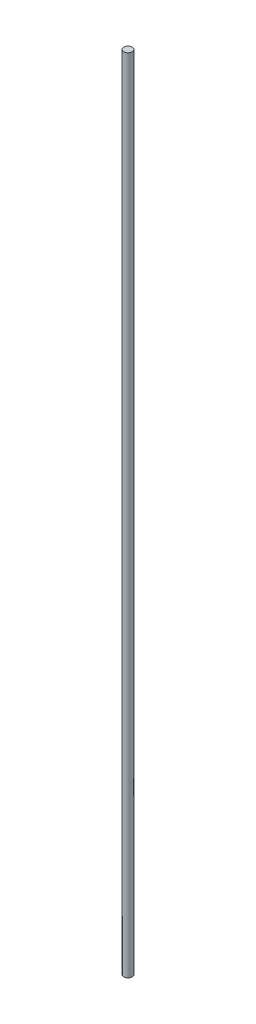
ISO-10303-21;
HEADER;
FILE_DESCRIPTION(('STEP AP214'),'2;1');
FILE_NAME('part.step','',(''),(''),'','','');
FILE_SCHEMA(('AUTOMOTIVE_DESIGN { 1 0 10303 214 1 1 1 1 }'));
ENDSEC;
DATA;
#1=APPLICATION_CONTEXT('core data for automotive mechanical design processes');
#2=APPLICATION_PROTOCOL_DEFINITION('international standard','automotive_design',2000,#1);
#3=PRODUCT_CONTEXT('',#1,'mechanical');
#4=PRODUCT('Part','Part','',(#3));
#5=PRODUCT_RELATED_PRODUCT_CATEGORY('part','',(#4));
#6=PRODUCT_DEFINITION_FORMATION('','',#4);
#7=PRODUCT_DEFINITION_CONTEXT('part definition',#1,'design');
#8=PRODUCT_DEFINITION('design','',#6,#7);
#9=PRODUCT_DEFINITION_SHAPE('','',#8);
#10=(LENGTH_UNIT() NAMED_UNIT(*) SI_UNIT(.MILLI.,.METRE.));
#11=(NAMED_UNIT(*) PLANE_ANGLE_UNIT() SI_UNIT($,.RADIAN.));
#12=(NAMED_UNIT(*) SI_UNIT($,.STERADIAN.) SOLID_ANGLE_UNIT());
#13=UNCERTAINTY_MEASURE_WITH_UNIT(LENGTH_MEASURE(1.E-05),#10,'distance_accuracy_value','');
#14=(GEOMETRIC_REPRESENTATION_CONTEXT(3) GLOBAL_UNCERTAINTY_ASSIGNED_CONTEXT((#13)) GLOBAL_UNIT_ASSIGNED_CONTEXT((#10,
#11,#12)) REPRESENTATION_CONTEXT('',''));
#15=CARTESIAN_POINT('',(0.,0.,0.));
#16=DIRECTION('',(0.,0.,1.));
#17=DIRECTION('',(1.,0.,0.));
#18=AXIS2_PLACEMENT_3D('',#15,#16,#17);
#19=CARTESIAN_POINT('',(0.,304.8,0.));
#20=DIRECTION('',(0.,-1.,0.));
#21=DIRECTION('',(0.,0.,-1.));
#22=AXIS2_PLACEMENT_3D('',#19,#20,#21);
#23=CYLINDRICAL_SURFACE('',#22,3.175);
#24=CARTESIAN_POINT('',(0.,304.8,0.));
#25=DIRECTION('',(0.,1.,0.));
#26=DIRECTION('',(0.,0.,1.));
#27=AXIS2_PLACEMENT_3D('',#24,#25,#26);
#28=CIRCLE('',#27,3.175);
#29=CARTESIAN_POINT('',(0.,304.8,-3.175));
#30=VERTEX_POINT('',#29);
#31=EDGE_CURVE('E10',#30,#30,#28,.T.);
#32=CARTESIAN_POINT('',(0.,-304.8,0.));
#33=DIRECTION('',(0.,1.,0.));
#34=DIRECTION('',(0.,0.,1.));
#35=AXIS2_PLACEMENT_3D('',#32,#33,#34);
#36=CIRCLE('',#35,3.175);
#37=CARTESIAN_POINT('',(0.,-304.8,-3.175));
#38=VERTEX_POINT('',#37);
#39=EDGE_CURVE('E36',#38,#38,#36,.T.);
#40=CARTESIAN_POINT('',(0.,304.8,-3.175));
#41=CARTESIAN_POINT('',(0.,298.45,-3.175));
#42=CARTESIAN_POINT('',(0.,292.1,-3.175));
#43=CARTESIAN_POINT('',(0.,279.4,-3.175));
#44=CARTESIAN_POINT('',(0.,273.05,-3.175));
#45=CARTESIAN_POINT('',(0.,260.35,-3.175));
#46=CARTESIAN_POINT('',(0.,254.,-3.175));
#47=CARTESIAN_POINT('',(0.,241.3,-3.175));
#48=CARTESIAN_POINT('',(0.,234.95,-3.175));
#49=CARTESIAN_POINT('',(0.,222.25,-3.175));
#50=CARTESIAN_POINT('',(0.,215.9,-3.175));
#51=CARTESIAN_POINT('',(0.,203.2,-3.175));
#52=CARTESIAN_POINT('',(0.,196.85,-3.175));
#53=CARTESIAN_POINT('',(0.,184.15,-3.175));
#54=CARTESIAN_POINT('',(0.,177.8,-3.175));
#55=CARTESIAN_POINT('',(0.,165.1,-3.175));
#56=CARTESIAN_POINT('',(0.,158.75,-3.175));
#57=CARTESIAN_POINT('',(0.,146.05,-3.175));
#58=CARTESIAN_POINT('',(0.,139.7,-3.175));
#59=CARTESIAN_POINT('',(0.,127.,-3.175));
#60=CARTESIAN_POINT('',(0.,120.65,-3.175));
#61=CARTESIAN_POINT('',(0.,107.95,-3.175));
#62=CARTESIAN_POINT('',(0.,101.6,-3.175));
#63=CARTESIAN_POINT('',(0.,88.9,-3.175));
#64=CARTESIAN_POINT('',(0.,82.55,-3.175));
#65=CARTESIAN_POINT('',(0.,69.85,-3.175));
#66=CARTESIAN_POINT('',(0.,63.5,-3.175));
#67=CARTESIAN_POINT('',(0.,50.8,-3.175));
#68=CARTESIAN_POINT('',(0.,44.45,-3.175));
#69=CARTESIAN_POINT('',(0.,31.75,-3.175));
#70=CARTESIAN_POINT('',(0.,25.4,-3.175));
#71=CARTESIAN_POINT('',(0.,12.7,-3.175));
#72=CARTESIAN_POINT('',(0.,6.35,-3.175));
#73=CARTESIAN_POINT('',(0.,-6.35,-3.175));
#74=CARTESIAN_POINT('',(0.,-12.7,-3.175));
#75=CARTESIAN_POINT('',(0.,-25.4,-3.175));
#76=CARTESIAN_POINT('',(0.,-31.75,-3.175));
#77=CARTESIAN_POINT('',(0.,-44.45,-3.175));
#78=CARTESIAN_POINT('',(0.,-50.8,-3.175));
#79=CARTESIAN_POINT('',(0.,-63.5,-3.175));
#80=CARTESIAN_POINT('',(0.,-69.85,-3.175));
#81=CARTESIAN_POINT('',(0.,-82.55,-3.175));
#82=CARTESIAN_POINT('',(0.,-88.9,-3.175));
#83=CARTESIAN_POINT('',(0.,-101.6,-3.175));
#84=CARTESIAN_POINT('',(0.,-107.95,-3.175));
#85=CARTESIAN_POINT('',(0.,-120.65,-3.175));
#86=CARTESIAN_POINT('',(0.,-127.,-3.175));
#87=CARTESIAN_POINT('',(0.,-139.7,-3.175));
#88=CARTESIAN_POINT('',(0.,-146.05,-3.175));
#89=CARTESIAN_POINT('',(0.,-158.75,-3.175));
#90=CARTESIAN_POINT('',(0.,-165.1,-3.175));
#91=CARTESIAN_POINT('',(0.,-177.8,-3.175));
#92=CARTESIAN_POINT('',(0.,-184.15,-3.175));
#93=CARTESIAN_POINT('',(0.,-196.85,-3.175));
#94=CARTESIAN_POINT('',(0.,-203.2,-3.175));
#95=CARTESIAN_POINT('',(0.,-215.9,-3.175));
#96=CARTESIAN_POINT('',(0.,-222.25,-3.175));
#97=CARTESIAN_POINT('',(0.,-234.95,-3.175));
#98=CARTESIAN_POINT('',(0.,-241.3,-3.175));
#99=CARTESIAN_POINT('',(0.,-254.,-3.175));
#100=CARTESIAN_POINT('',(0.,-260.35,-3.175));
#101=CARTESIAN_POINT('',(0.,-273.05,-3.175));
#102=CARTESIAN_POINT('',(0.,-279.4,-3.175));
#103=CARTESIAN_POINT('',(0.,-292.1,-3.175));
#104=CARTESIAN_POINT('',(0.,-298.45,-3.175));
#105=CARTESIAN_POINT('',(0.,-304.8,-3.175));
#106=B_SPLINE_CURVE_WITH_KNOTS('',3,(#40,#41,#42,#43,#44,#45,#46,#47,#48,#49,#50,#51,#52,#53,
#54,#55,#56,#57,#58,#59,#60,#61,#62,#63,#64,#65,#66,#67,#68,#69,#70,#71,#72,#73,#74,#75,#76,#77,
#78,#79,#80,#81,#82,#83,#84,#85,#86,#87,#88,#89,#90,#91,#92,#93,#94,#95,#96,#97,#98,#99,#100,
#101,#102,#103,#104,#105),.UNSPECIFIED.,.F.,.F.,(4,2,2,2,2,2,2,2,2,2,2,2,2,2,2,2,2,2,2,2,2,2,2,
2,2,2,2,2,2,2,2,2,4),(0.,19.05,38.1,57.15,76.2,95.2500000000001,114.3,133.35,152.4,171.45,190.5,
209.55,228.6,247.65,266.7,285.75,304.8,323.85,342.9,361.95,381.,400.05,419.1,438.15,457.2,
476.25,495.3,514.35,533.4,552.45,571.5,590.55,609.6),.UNSPECIFIED.);
#107=EDGE_CURVE('BSEAM33',#30,#38,#106,.T.);
#108=ORIENTED_EDGE('',*,*,#31,.F.);
#109=ORIENTED_EDGE('',*,*,#39,.T.);
#110=ORIENTED_EDGE('',*,*,#107,.T.);
#111=ORIENTED_EDGE('',*,*,#107,.F.);
#112=EDGE_LOOP('',(#108,#110,#109,#111));
#113=FACE_BOUND('',#112,.T.);
#114=ADVANCED_FACE('F33',(#113),#23,.T.);
#115=CARTESIAN_POINT('',(0.,304.8,0.));
#116=DIRECTION('',(0.,1.,0.));
#117=DIRECTION('',(0.,0.,1.));
#118=AXIS2_PLACEMENT_3D('',#115,#116,#117);
#119=PLANE('',#118);
#120=ORIENTED_EDGE('',*,*,#31,.T.);
#121=EDGE_LOOP('',(#120));
#122=FACE_BOUND('',#121,.T.);
#123=ADVANCED_FACE('F48',(#122),#119,.T.);
#124=CARTESIAN_POINT('',(0.,-304.8,0.));
#125=DIRECTION('',(0.,1.,0.));
#126=DIRECTION('',(0.,0.,1.));
#127=AXIS2_PLACEMENT_3D('',#124,#125,#126);
#128=PLANE('',#127);
#129=ORIENTED_EDGE('',*,*,#39,.F.);
#130=EDGE_LOOP('',(#129));
#131=FACE_BOUND('',#130,.T.);
#132=ADVANCED_FACE('F46',(#131),#128,.F.);
#133=CLOSED_SHELL('',(#114,#123,#132));
#134=MANIFOLD_SOLID_BREP('B2',#133);
#135=ADVANCED_BREP_SHAPE_REPRESENTATION('',(#18,#134),#14);
#136=SHAPE_DEFINITION_REPRESENTATION(#9,#135);
ENDSEC;
END-ISO-10303-21;
